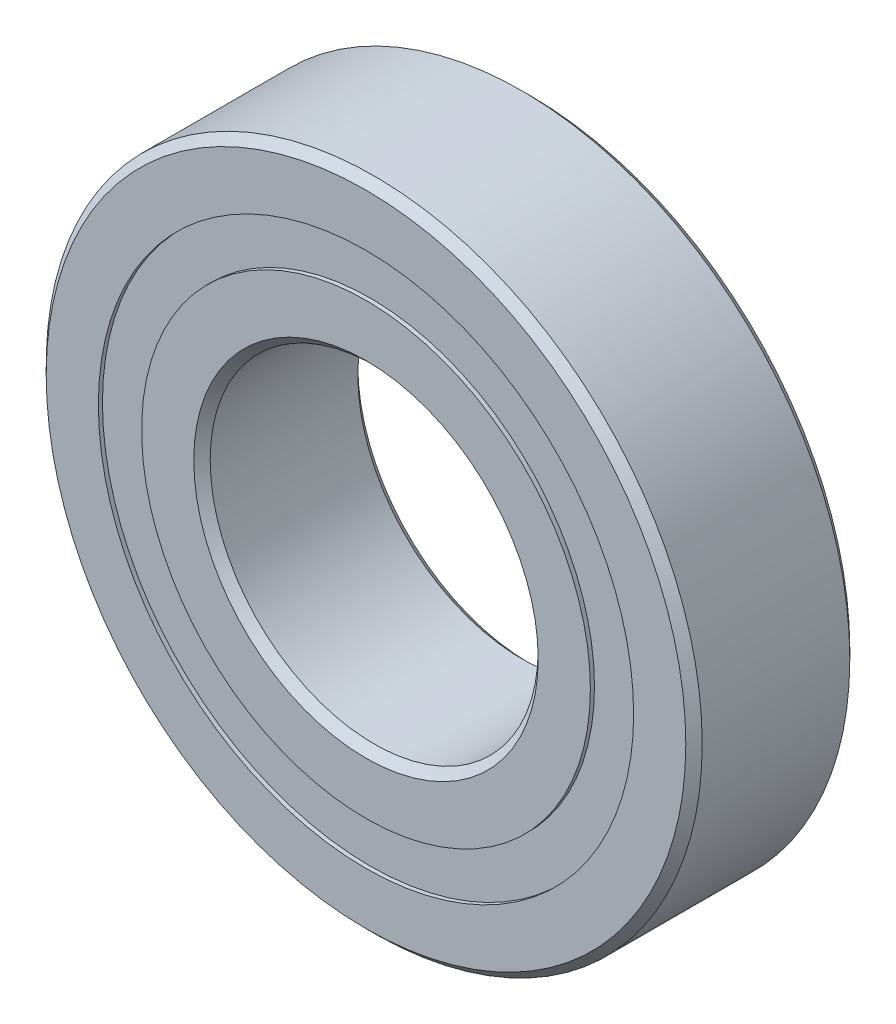
ISO-10303-21;
HEADER;
FILE_DESCRIPTION(('STEP AP214'),'2;1');
FILE_NAME('part.step','',(''),(''),'','','');
FILE_SCHEMA(('AUTOMOTIVE_DESIGN { 1 0 10303 214 1 1 1 1 }'));
ENDSEC;
DATA;
#1=APPLICATION_CONTEXT('core data for automotive mechanical design processes');
#2=APPLICATION_PROTOCOL_DEFINITION('international standard','automotive_design',2000,#1);
#3=PRODUCT_CONTEXT('',#1,'mechanical');
#4=PRODUCT('Part','Part','',(#3));
#5=PRODUCT_RELATED_PRODUCT_CATEGORY('part','',(#4));
#6=PRODUCT_DEFINITION_FORMATION('','',#4);
#7=PRODUCT_DEFINITION_CONTEXT('part definition',#1,'design');
#8=PRODUCT_DEFINITION('design','',#6,#7);
#9=PRODUCT_DEFINITION_SHAPE('','',#8);
#10=(LENGTH_UNIT() NAMED_UNIT(*) SI_UNIT(.MILLI.,.METRE.));
#11=(NAMED_UNIT(*) PLANE_ANGLE_UNIT() SI_UNIT($,.RADIAN.));
#12=(NAMED_UNIT(*) SI_UNIT($,.STERADIAN.) SOLID_ANGLE_UNIT());
#13=UNCERTAINTY_MEASURE_WITH_UNIT(LENGTH_MEASURE(1.E-05),#10,'distance_accuracy_value','');
#14=(GEOMETRIC_REPRESENTATION_CONTEXT(3) GLOBAL_UNCERTAINTY_ASSIGNED_CONTEXT((#13)) GLOBAL_UNIT_ASSIGNED_CONTEXT((#10,
#11,#12)) REPRESENTATION_CONTEXT('',''));
#15=CARTESIAN_POINT('',(0.,0.,0.));
#16=DIRECTION('',(0.,0.,1.));
#17=DIRECTION('',(1.,0.,0.));
#18=AXIS2_PLACEMENT_3D('',#15,#16,#17);
#19=CARTESIAN_POINT('',(0.,20.7247252747253,-6.0325));
#20=DIRECTION('',(0.,0.,1.));
#21=DIRECTION('',(1.,0.,0.));
#22=AXIS2_PLACEMENT_3D('',#19,#20,#21);
#23=PLANE('',#22);
#24=CARTESIAN_POINT('',(0.,0.,-6.0325));
#25=DIRECTION('',(0.,0.,1.));
#26=DIRECTION('',(1.,0.,0.));
#27=AXIS2_PLACEMENT_3D('',#24,#25,#26);
#28=CIRCLE('',#27,20.7247252747253);
#29=CARTESIAN_POINT('',(20.7247252747253,0.,-6.0325));
#30=VERTEX_POINT('',#29);
#31=EDGE_CURVE('E60',#30,#30,#28,.T.);
#32=ORIENTED_EDGE('',*,*,#31,.F.);
#33=EDGE_LOOP('',(#32));
#34=FACE_BOUND('',#33,.T.);
#35=CARTESIAN_POINT('',(0.,0.,-6.0325));
#36=DIRECTION('',(0.,0.,1.));
#37=DIRECTION('',(1.,0.,0.));
#38=AXIS2_PLACEMENT_3D('',#35,#36,#37);
#39=CIRCLE('',#38,17.3752747252747);
#40=CARTESIAN_POINT('',(17.3752747252747,0.,-6.0325));
#41=VERTEX_POINT('',#40);
#42=EDGE_CURVE('E11',#41,#41,#39,.T.);
#43=ORIENTED_EDGE('',*,*,#42,.T.);
#44=EDGE_LOOP('',(#43));
#45=FACE_BOUND('',#44,.T.);
#46=ADVANCED_FACE('F46',(#34,#45),#23,.F.);
#47=CARTESIAN_POINT('',(0.,0.,6.35));
#48=DIRECTION('',(0.,0.,1.));
#49=DIRECTION('',(1.,0.,0.));
#50=AXIS2_PLACEMENT_3D('',#47,#48,#49);
#51=CYLINDRICAL_SURFACE('',#50,17.3752747252747);
#52=ORIENTED_EDGE('',*,*,#42,.F.);
#53=EDGE_LOOP('',(#52));
#54=FACE_BOUND('',#53,.T.);
#55=CARTESIAN_POINT('',(0.,0.,-3.28171342706955));
#56=DIRECTION('',(0.,0.,1.));
#57=DIRECTION('',(1.,0.,0.));
#58=AXIS2_PLACEMENT_3D('',#55,#56,#57);
#59=CIRCLE('',#58,17.3752747252747);
#60=CARTESIAN_POINT('',(17.3752747252747,0.,-3.28171342706955));
#61=VERTEX_POINT('',#60);
#62=EDGE_CURVE('E52',#61,#61,#59,.T.);
#63=ORIENTED_EDGE('',*,*,#62,.T.);
#64=EDGE_LOOP('',(#63));
#65=FACE_BOUND('',#64,.T.);
#66=ADVANCED_FACE('F69',(#54,#65),#51,.F.);
#67=CARTESIAN_POINT('',(0.,20.7247252747253,-3.28171342706955));
#68=DIRECTION('',(0.,0.,-1.));
#69=DIRECTION('',(-1.,0.,0.));
#70=AXIS2_PLACEMENT_3D('',#67,#68,#69);
#71=PLANE('',#70);
#72=ORIENTED_EDGE('',*,*,#62,.F.);
#73=EDGE_LOOP('',(#72));
#74=FACE_BOUND('',#73,.T.);
#75=CARTESIAN_POINT('',(0.,0.,-3.28171342706955));
#76=DIRECTION('',(0.,0.,1.));
#77=DIRECTION('',(1.,0.,0.));
#78=AXIS2_PLACEMENT_3D('',#75,#76,#77);
#79=CIRCLE('',#78,20.7247252747253);
#80=CARTESIAN_POINT('',(20.7247252747253,0.,-3.28171342706955));
#81=VERTEX_POINT('',#80);
#82=EDGE_CURVE('E56',#81,#81,#79,.T.);
#83=ORIENTED_EDGE('',*,*,#82,.T.);
#84=EDGE_LOOP('',(#83));
#85=FACE_BOUND('',#84,.T.);
#86=ADVANCED_FACE('F73',(#74,#85),#71,.F.);
#87=CARTESIAN_POINT('',(0.,0.,6.35));
#88=DIRECTION('',(0.,0.,1.));
#89=DIRECTION('',(1.,0.,0.));
#90=AXIS2_PLACEMENT_3D('',#87,#88,#89);
#91=CYLINDRICAL_SURFACE('',#90,20.7247252747253);
#92=ORIENTED_EDGE('',*,*,#82,.F.);
#93=EDGE_LOOP('',(#92));
#94=FACE_BOUND('',#93,.T.);
#95=ORIENTED_EDGE('',*,*,#31,.T.);
#96=EDGE_LOOP('',(#95));
#97=FACE_BOUND('',#96,.T.);
#98=ADVANCED_FACE('F66',(#94,#97),#91,.T.);
#99=CLOSED_SHELL('',(#46,#66,#86,#98));
#100=MANIFOLD_SOLID_BREP('B2',#99);
#101=CARTESIAN_POINT('',(0.,20.7247252747253,6.0325));
#102=DIRECTION('',(0.,0.,-1.));
#103=DIRECTION('',(-1.,0.,0.));
#104=AXIS2_PLACEMENT_3D('',#101,#102,#103);
#105=PLANE('',#104);
#106=CARTESIAN_POINT('',(0.,0.,6.0325));
#107=DIRECTION('',(0.,0.,1.));
#108=DIRECTION('',(1.,0.,0.));
#109=AXIS2_PLACEMENT_3D('',#106,#107,#108);
#110=CIRCLE('',#109,17.3752747252747);
#111=CARTESIAN_POINT('',(17.3752747252747,0.,6.0325));
#112=VERTEX_POINT('',#111);
#113=EDGE_CURVE('E45',#112,#112,#110,.T.);
#114=ORIENTED_EDGE('',*,*,#113,.F.);
#115=EDGE_LOOP('',(#114));
#116=FACE_BOUND('',#115,.T.);
#117=CARTESIAN_POINT('',(0.,0.,6.0325));
#118=DIRECTION('',(0.,0.,1.));
#119=DIRECTION('',(1.,0.,0.));
#120=AXIS2_PLACEMENT_3D('',#117,#118,#119);
#121=CIRCLE('',#120,20.7247252747253);
#122=CARTESIAN_POINT('',(20.7247252747253,0.,6.0325));
#123=VERTEX_POINT('',#122);
#124=EDGE_CURVE('E128',#123,#123,#121,.T.);
#125=ORIENTED_EDGE('',*,*,#124,.T.);
#126=EDGE_LOOP('',(#125));
#127=FACE_BOUND('',#126,.T.);
#128=ADVANCED_FACE('F114',(#116,#127),#105,.F.);
#129=CARTESIAN_POINT('',(0.,0.,6.35));
#130=DIRECTION('',(0.,0.,1.));
#131=DIRECTION('',(1.,0.,0.));
#132=AXIS2_PLACEMENT_3D('',#129,#130,#131);
#133=CYLINDRICAL_SURFACE('',#132,17.3752747252747);
#134=CARTESIAN_POINT('',(0.,0.,3.28171342706955));
#135=DIRECTION('',(0.,0.,1.));
#136=DIRECTION('',(1.,0.,0.));
#137=AXIS2_PLACEMENT_3D('',#134,#135,#136);
#138=CIRCLE('',#137,17.3752747252747);
#139=CARTESIAN_POINT('',(17.3752747252747,0.,3.28171342706955));
#140=VERTEX_POINT('',#139);
#141=EDGE_CURVE('E120',#140,#140,#138,.T.);
#142=ORIENTED_EDGE('',*,*,#141,.F.);
#143=EDGE_LOOP('',(#142));
#144=FACE_BOUND('',#143,.T.);
#145=ORIENTED_EDGE('',*,*,#113,.T.);
#146=EDGE_LOOP('',(#145));
#147=FACE_BOUND('',#146,.T.);
#148=ADVANCED_FACE('F143',(#144,#147),#133,.F.);
#149=CARTESIAN_POINT('',(0.,20.7247252747253,3.28171342706955));
#150=DIRECTION('',(0.,0.,1.));
#151=DIRECTION('',(1.,0.,0.));
#152=AXIS2_PLACEMENT_3D('',#149,#150,#151);
#153=PLANE('',#152);
#154=CARTESIAN_POINT('',(0.,0.,3.28171342706955));
#155=DIRECTION('',(0.,0.,1.));
#156=DIRECTION('',(1.,0.,0.));
#157=AXIS2_PLACEMENT_3D('',#154,#155,#156);
#158=CIRCLE('',#157,20.7247252747253);
#159=CARTESIAN_POINT('',(20.7247252747253,0.,3.28171342706955));
#160=VERTEX_POINT('',#159);
#161=EDGE_CURVE('E124',#160,#160,#158,.T.);
#162=ORIENTED_EDGE('',*,*,#161,.F.);
#163=EDGE_LOOP('',(#162));
#164=FACE_BOUND('',#163,.T.);
#165=ORIENTED_EDGE('',*,*,#141,.T.);
#166=EDGE_LOOP('',(#165));
#167=FACE_BOUND('',#166,.T.);
#168=ADVANCED_FACE('F138',(#164,#167),#153,.F.);
#169=CARTESIAN_POINT('',(0.,0.,6.35));
#170=DIRECTION('',(0.,0.,1.));
#171=DIRECTION('',(1.,0.,0.));
#172=AXIS2_PLACEMENT_3D('',#169,#170,#171);
#173=CYLINDRICAL_SURFACE('',#172,20.7247252747253);
#174=ORIENTED_EDGE('',*,*,#124,.F.);
#175=EDGE_LOOP('',(#174));
#176=FACE_BOUND('',#175,.T.);
#177=ORIENTED_EDGE('',*,*,#161,.T.);
#178=EDGE_LOOP('',(#177));
#179=FACE_BOUND('',#178,.T.);
#180=ADVANCED_FACE('F135',(#176,#179),#173,.T.);
#181=CLOSED_SHELL('',(#128,#148,#168,#180));
#182=MANIFOLD_SOLID_BREP('B6',#181);
#183=CARTESIAN_POINT('',(-9.52499999999979,16.4977839420937,0.));
#184=DIRECTION('',(0.,0.,1.));
#185=DIRECTION('',(-0.499999999999989,0.866025403784445,0.));
#186=AXIS2_PLACEMENT_3D('',#183,#184,#185);
#187=SPHERICAL_SURFACE('',#186,3.28171342706955);
#188=CARTESIAN_POINT('',(-9.52499999999979,16.4977839420937,3.28171342706955));
#189=VERTEX_POINT('',#188);
#190=VERTEX_LOOP('',#189);
#191=FACE_BOUND('',#190,.T.);
#192=ADVANCED_FACE('F182',(#191),#187,.T.);
#193=CLOSED_SHELL('',(#192));
#194=MANIFOLD_SOLID_BREP('B40',#193);
#195=CARTESIAN_POINT('',(-16.4977839420934,9.52500000000019,0.));
#196=DIRECTION('',(0.,0.,1.));
#197=DIRECTION('',(-0.866025403784433,0.50000000000001,0.));
#198=AXIS2_PLACEMENT_3D('',#195,#196,#197);
#199=SPHERICAL_SURFACE('',#198,3.28171342706955);
#200=CARTESIAN_POINT('',(-16.4977839420934,9.52500000000019,3.28171342706955));
#201=VERTEX_POINT('',#200);
#202=VERTEX_LOOP('',#201);
#203=FACE_BOUND('',#202,.T.);
#204=ADVANCED_FACE('F203',(#203),#199,.T.);
#205=CLOSED_SHELL('',(#204));
#206=MANIFOLD_SOLID_BREP('B110',#205);
#207=CARTESIAN_POINT('',(-19.05,1.99538158514885E-13,0.));
#208=DIRECTION('',(0.,0.,1.));
#209=DIRECTION('',(-1.,0.,0.));
#210=AXIS2_PLACEMENT_3D('',#207,#208,#209);
#211=SPHERICAL_SURFACE('',#210,3.28171342706955);
#212=CARTESIAN_POINT('',(-19.05,1.99538158514885E-13,3.28171342706955));
#213=VERTEX_POINT('',#212);
#214=VERTEX_LOOP('',#213);
#215=FACE_BOUND('',#214,.T.);
#216=ADVANCED_FACE('F224',(#215),#211,.T.);
#217=CLOSED_SHELL('',(#216));
#218=MANIFOLD_SOLID_BREP('B178',#217);
#219=CARTESIAN_POINT('',(-16.4977839420936,-9.52499999999985,0.));
#220=DIRECTION('',(0.,0.,1.));
#221=DIRECTION('',(-0.866025403784443,-0.499999999999992,0.));
#222=AXIS2_PLACEMENT_3D('',#219,#220,#221);
#223=SPHERICAL_SURFACE('',#222,3.28171342706955);
#224=CARTESIAN_POINT('',(-16.4977839420936,-9.52499999999985,3.28171342706955));
#225=VERTEX_POINT('',#224);
#226=VERTEX_LOOP('',#225);
#227=FACE_BOUND('',#226,.T.);
#228=ADVANCED_FACE('F245',(#227),#223,.T.);
#229=CLOSED_SHELL('',(#228));
#230=MANIFOLD_SOLID_BREP('B199',#229);
#231=CARTESIAN_POINT('',(-9.52500000000013,-16.4977839420935,0.));
#232=DIRECTION('',(0.,0.,1.));
#233=DIRECTION('',(-0.500000000000007,-0.866025403784435,0.));
#234=AXIS2_PLACEMENT_3D('',#231,#232,#233);
#235=SPHERICAL_SURFACE('',#234,3.28171342706955);
#236=CARTESIAN_POINT('',(-9.52500000000013,-16.4977839420935,3.28171342706955));
#237=VERTEX_POINT('',#236);
#238=VERTEX_LOOP('',#237);
#239=FACE_BOUND('',#238,.T.);
#240=ADVANCED_FACE('F266',(#239),#235,.T.);
#241=CLOSED_SHELL('',(#240));
#242=MANIFOLD_SOLID_BREP('B220',#241);
#243=CARTESIAN_POINT('',(-1.33025439009923E-13,-19.05,0.));
#244=DIRECTION('',(0.,0.,1.));
#245=DIRECTION('',(0.,-1.,0.));
#246=AXIS2_PLACEMENT_3D('',#243,#244,#245);
#247=SPHERICAL_SURFACE('',#246,3.28171342706955);
#248=CARTESIAN_POINT('',(-1.33025439009923E-13,-19.05,3.28171342706955));
#249=VERTEX_POINT('',#248);
#250=VERTEX_LOOP('',#249);
#251=FACE_BOUND('',#250,.T.);
#252=ADVANCED_FACE('F287',(#251),#247,.T.);
#253=CLOSED_SHELL('',(#252));
#254=MANIFOLD_SOLID_BREP('B241',#253);
#255=CARTESIAN_POINT('',(9.5249999999999,-16.4977839420936,0.));
#256=DIRECTION('',(0.,0.,1.));
#257=DIRECTION('',(0.499999999999995,-0.866025403784442,0.));
#258=AXIS2_PLACEMENT_3D('',#255,#256,#257);
#259=SPHERICAL_SURFACE('',#258,3.28171342706955);
#260=CARTESIAN_POINT('',(9.5249999999999,-16.4977839420936,3.28171342706955));
#261=VERTEX_POINT('',#260);
#262=VERTEX_LOOP('',#261);
#263=FACE_BOUND('',#262,.T.);
#264=ADVANCED_FACE('F308',(#263),#259,.T.);
#265=CLOSED_SHELL('',(#264));
#266=MANIFOLD_SOLID_BREP('B262',#265);
#267=CARTESIAN_POINT('',(16.4977839420935,-9.52500000000008,0.));
#268=DIRECTION('',(0.,0.,1.));
#269=DIRECTION('',(0.866025403784436,-0.500000000000004,0.));
#270=AXIS2_PLACEMENT_3D('',#267,#268,#269);
#271=SPHERICAL_SURFACE('',#270,3.28171342706955);
#272=CARTESIAN_POINT('',(16.4977839420935,-9.52500000000008,3.28171342706955));
#273=VERTEX_POINT('',#272);
#274=VERTEX_LOOP('',#273);
#275=FACE_BOUND('',#274,.T.);
#276=ADVANCED_FACE('F329',(#275),#271,.T.);
#277=CLOSED_SHELL('',(#276));
#278=MANIFOLD_SOLID_BREP('B283',#277);
#279=CARTESIAN_POINT('',(19.05,0.,0.));
#280=DIRECTION('',(0.,0.,1.));
#281=DIRECTION('',(1.,0.,0.));
#282=AXIS2_PLACEMENT_3D('',#279,#280,#281);
#283=SPHERICAL_SURFACE('',#282,3.28171342706955);
#284=CARTESIAN_POINT('',(19.05,0.,3.28171342706955));
#285=VERTEX_POINT('',#284);
#286=VERTEX_LOOP('',#285);
#287=FACE_BOUND('',#286,.T.);
#288=ADVANCED_FACE('F350',(#287),#283,.T.);
#289=CLOSED_SHELL('',(#288));
#290=MANIFOLD_SOLID_BREP('B304',#289);
#291=CARTESIAN_POINT('',(16.4977839420936,9.52499999999996,0.));
#292=DIRECTION('',(0.,0.,1.));
#293=DIRECTION('',(0.86602540378444,0.499999999999998,0.));
#294=AXIS2_PLACEMENT_3D('',#291,#292,#293);
#295=SPHERICAL_SURFACE('',#294,3.28171342706955);
#296=CARTESIAN_POINT('',(16.4977839420936,9.52499999999996,3.28171342706955));
#297=VERTEX_POINT('',#296);
#298=VERTEX_LOOP('',#297);
#299=FACE_BOUND('',#298,.T.);
#300=ADVANCED_FACE('F371',(#299),#295,.T.);
#301=CLOSED_SHELL('',(#300));
#302=MANIFOLD_SOLID_BREP('B325',#301);
#303=CARTESIAN_POINT('',(9.52500000000002,16.4977839420935,0.));
#304=DIRECTION('',(0.,0.,1.));
#305=DIRECTION('',(0.500000000000001,0.866025403784438,0.));
#306=AXIS2_PLACEMENT_3D('',#303,#304,#305);
#307=SPHERICAL_SURFACE('',#306,3.28171342706955);
#308=CARTESIAN_POINT('',(9.52500000000002,16.4977839420935,3.28171342706955));
#309=VERTEX_POINT('',#308);
#310=VERTEX_LOOP('',#309);
#311=FACE_BOUND('',#310,.T.);
#312=ADVANCED_FACE('F392',(#311),#307,.T.);
#313=CLOSED_SHELL('',(#312));
#314=MANIFOLD_SOLID_BREP('B346',#313);
#315=CARTESIAN_POINT('',(0.,19.05,0.));
#316=DIRECTION('',(0.,0.,1.));
#317=DIRECTION('',(0.,1.,0.));
#318=AXIS2_PLACEMENT_3D('',#315,#316,#317);
#319=SPHERICAL_SURFACE('',#318,3.28171342706955);
#320=CARTESIAN_POINT('',(0.,19.05,3.28171342706955));
#321=VERTEX_POINT('',#320);
#322=VERTEX_LOOP('',#321);
#323=FACE_BOUND('',#322,.T.);
#324=ADVANCED_FACE('F415',(#323),#319,.T.);
#325=CLOSED_SHELL('',(#324));
#326=MANIFOLD_SOLID_BREP('B367',#325);
#327=CARTESIAN_POINT('',(0.,17.3752747252747,6.35));
#328=DIRECTION('',(0.,0.,-1.));
#329=DIRECTION('',(-1.,0.,0.));
#330=AXIS2_PLACEMENT_3D('',#327,#328,#329);
#331=PLANE('',#330);
#332=CARTESIAN_POINT('',(0.,0.,6.35));
#333=DIRECTION('',(0.,0.,1.));
#334=DIRECTION('',(1.,0.,0.));
#335=AXIS2_PLACEMENT_3D('',#332,#333,#334);
#336=CIRCLE('',#335,13.335);
#337=CARTESIAN_POINT('',(13.335,0.,6.35));
#338=VERTEX_POINT('',#337);
#339=EDGE_CURVE('E463',#338,#338,#336,.T.);
#340=ORIENTED_EDGE('',*,*,#339,.F.);
#341=EDGE_LOOP('',(#340));
#342=FACE_BOUND('',#341,.T.);
#343=CARTESIAN_POINT('',(0.,0.,6.35));
#344=DIRECTION('',(0.,0.,1.));
#345=DIRECTION('',(1.,0.,0.));
#346=AXIS2_PLACEMENT_3D('',#343,#344,#345);
#347=CIRCLE('',#346,17.3752747252747);
#348=CARTESIAN_POINT('',(17.3752747252747,0.,6.35));
#349=VERTEX_POINT('',#348);
#350=EDGE_CURVE('E414',#349,#349,#347,.T.);
#351=ORIENTED_EDGE('',*,*,#350,.T.);
#352=EDGE_LOOP('',(#351));
#353=FACE_BOUND('',#352,.T.);
#354=ADVANCED_FACE('F435',(#342,#353),#331,.F.);
#355=CARTESIAN_POINT('',(0.,0.,6.35));
#356=DIRECTION('',(0.,0.,1.));
#357=DIRECTION('',(1.,0.,0.));
#358=AXIS2_PLACEMENT_3D('',#355,#356,#357);
#359=CYLINDRICAL_SURFACE('',#358,17.3752747252747);
#360=ORIENTED_EDGE('',*,*,#350,.F.);
#361=EDGE_LOOP('',(#360));
#362=FACE_BOUND('',#361,.T.);
#363=CARTESIAN_POINT('',(0.,0.,2.82222222222222));
#364=DIRECTION('',(0.,0.,1.));
#365=DIRECTION('',(1.,0.,0.));
#366=AXIS2_PLACEMENT_3D('',#363,#364,#365);
#367=CIRCLE('',#366,17.3752747252747);
#368=CARTESIAN_POINT('',(17.3752747252747,0.,2.82222222222222));
#369=VERTEX_POINT('',#368);
#370=EDGE_CURVE('E441',#369,#369,#367,.T.);
#371=ORIENTED_EDGE('',*,*,#370,.T.);
#372=EDGE_LOOP('',(#371));
#373=FACE_BOUND('',#372,.T.);
#374=ADVANCED_FACE('F470',(#362,#373),#359,.T.);
#375=CARTESIAN_POINT('',(0.,0.,0.));
#376=DIRECTION('',(0.,0.,1.));
#377=DIRECTION('',(1.,0.,0.));
#378=AXIS2_PLACEMENT_3D('',#375,#376,#377);
#379=TOROIDAL_SURFACE('',#378,19.05,3.28171342706954);
#380=ORIENTED_EDGE('',*,*,#370,.F.);
#381=EDGE_LOOP('',(#380));
#382=FACE_BOUND('',#381,.T.);
#383=CARTESIAN_POINT('',(0.,0.,-2.82222222222223));
#384=DIRECTION('',(0.,0.,1.));
#385=DIRECTION('',(1.,0.,0.));
#386=AXIS2_PLACEMENT_3D('',#383,#384,#385);
#387=CIRCLE('',#386,17.3752747252747);
#388=CARTESIAN_POINT('',(17.3752747252747,0.,-2.82222222222223));
#389=VERTEX_POINT('',#388);
#390=EDGE_CURVE('E445',#389,#389,#387,.T.);
#391=ORIENTED_EDGE('',*,*,#390,.T.);
#392=EDGE_LOOP('',(#391));
#393=FACE_BOUND('',#392,.T.);
#394=ADVANCED_FACE('F474',(#382,#393),#379,.F.);
#395=CARTESIAN_POINT('',(0.,0.,6.35));
#396=DIRECTION('',(0.,0.,1.));
#397=DIRECTION('',(1.,0.,0.));
#398=AXIS2_PLACEMENT_3D('',#395,#396,#397);
#399=CYLINDRICAL_SURFACE('',#398,17.3752747252747);
#400=ORIENTED_EDGE('',*,*,#390,.F.);
#401=EDGE_LOOP('',(#400));
#402=FACE_BOUND('',#401,.T.);
#403=CARTESIAN_POINT('',(0.,0.,-6.35));
#404=DIRECTION('',(0.,0.,1.));
#405=DIRECTION('',(1.,0.,0.));
#406=AXIS2_PLACEMENT_3D('',#403,#404,#405);
#407=CIRCLE('',#406,17.3752747252747);
#408=CARTESIAN_POINT('',(17.3752747252747,0.,-6.35));
#409=VERTEX_POINT('',#408);
#410=EDGE_CURVE('E449',#409,#409,#407,.T.);
#411=ORIENTED_EDGE('',*,*,#410,.T.);
#412=EDGE_LOOP('',(#411));
#413=FACE_BOUND('',#412,.T.);
#414=ADVANCED_FACE('F479',(#402,#413),#399,.T.);
#415=CARTESIAN_POINT('',(0.,13.335,-6.35));
#416=DIRECTION('',(0.,0.,1.));
#417=DIRECTION('',(1.,0.,0.));
#418=AXIS2_PLACEMENT_3D('',#415,#416,#417);
#419=PLANE('',#418);
#420=ORIENTED_EDGE('',*,*,#410,.F.);
#421=EDGE_LOOP('',(#420));
#422=FACE_BOUND('',#421,.T.);
#423=CARTESIAN_POINT('',(0.,0.,-6.35));
#424=DIRECTION('',(0.,0.,1.));
#425=DIRECTION('',(1.,0.,0.));
#426=AXIS2_PLACEMENT_3D('',#423,#424,#425);
#427=CIRCLE('',#426,13.335);
#428=CARTESIAN_POINT('',(13.335,0.,-6.35));
#429=VERTEX_POINT('',#428);
#430=EDGE_CURVE('E454',#429,#429,#427,.T.);
#431=ORIENTED_EDGE('',*,*,#430,.T.);
#432=EDGE_LOOP('',(#431));
#433=FACE_BOUND('',#432,.T.);
#434=ADVANCED_FACE('F485',(#422,#433),#419,.F.);
#435=CARTESIAN_POINT('',(0.,0.,-5.715));
#436=DIRECTION('',(0.,0.,-1.));
#437=DIRECTION('',(-1.,0.,0.));
#438=AXIS2_PLACEMENT_3D('',#435,#436,#437);
#439=CONICAL_SURFACE('',#438,12.7,0.785398163397444);
#440=ORIENTED_EDGE('',*,*,#430,.F.);
#441=EDGE_LOOP('',(#440));
#442=FACE_BOUND('',#441,.T.);
#443=CARTESIAN_POINT('',(0.,0.,-5.715));
#444=DIRECTION('',(0.,0.,1.));
#445=DIRECTION('',(1.,0.,0.));
#446=AXIS2_PLACEMENT_3D('',#443,#444,#445);
#447=CIRCLE('',#446,12.7);
#448=CARTESIAN_POINT('',(12.7,0.,-5.715));
#449=VERTEX_POINT('',#448);
#450=EDGE_CURVE('E457',#449,#449,#447,.T.);
#451=ORIENTED_EDGE('',*,*,#450,.T.);
#452=EDGE_LOOP('',(#451));
#453=FACE_BOUND('',#452,.T.);
#454=ADVANCED_FACE('F489',(#442,#453),#439,.F.);
#455=CARTESIAN_POINT('',(0.,0.,6.35));
#456=DIRECTION('',(0.,0.,1.));
#457=DIRECTION('',(1.,0.,0.));
#458=AXIS2_PLACEMENT_3D('',#455,#456,#457);
#459=CYLINDRICAL_SURFACE('',#458,12.7);
#460=ORIENTED_EDGE('',*,*,#450,.F.);
#461=EDGE_LOOP('',(#460));
#462=FACE_BOUND('',#461,.T.);
#463=CARTESIAN_POINT('',(0.,0.,5.71500000000001));
#464=DIRECTION('',(0.,0.,1.));
#465=DIRECTION('',(1.,0.,0.));
#466=AXIS2_PLACEMENT_3D('',#463,#464,#465);
#467=CIRCLE('',#466,12.7);
#468=CARTESIAN_POINT('',(12.7,0.,5.71500000000001));
#469=VERTEX_POINT('',#468);
#470=EDGE_CURVE('E460',#469,#469,#467,.T.);
#471=ORIENTED_EDGE('',*,*,#470,.T.);
#472=EDGE_LOOP('',(#471));
#473=FACE_BOUND('',#472,.T.);
#474=ADVANCED_FACE('F493',(#462,#473),#459,.F.);
#475=CARTESIAN_POINT('',(0.,0.,6.35));
#476=DIRECTION('',(0.,0.,1.));
#477=DIRECTION('',(1.,0.,0.));
#478=AXIS2_PLACEMENT_3D('',#475,#476,#477);
#479=CONICAL_SURFACE('',#478,13.335,0.785398163397454);
#480=ORIENTED_EDGE('',*,*,#470,.F.);
#481=EDGE_LOOP('',(#480));
#482=FACE_BOUND('',#481,.T.);
#483=ORIENTED_EDGE('',*,*,#339,.T.);
#484=EDGE_LOOP('',(#483));
#485=FACE_BOUND('',#484,.T.);
#486=ADVANCED_FACE('F467',(#482,#485),#479,.F.);
#487=CLOSED_SHELL('',(#354,#374,#394,#414,#434,#454,#474,#486));
#488=MANIFOLD_SOLID_BREP('B388',#487);
#489=CARTESIAN_POINT('',(0.,0.,5.715));
#490=DIRECTION('',(0.,0.,-1.));
#491=DIRECTION('',(-1.,0.,0.));
#492=AXIS2_PLACEMENT_3D('',#489,#490,#491);
#493=CONICAL_SURFACE('',#492,25.4,0.785398163397444);
#494=CARTESIAN_POINT('',(0.,0.,6.35));
#495=DIRECTION('',(0.,0.,1.));
#496=DIRECTION('',(1.,0.,0.));
#497=AXIS2_PLACEMENT_3D('',#494,#495,#496);
#498=CIRCLE('',#497,24.765);
#499=CARTESIAN_POINT('',(24.765,0.,6.35));
#500=VERTEX_POINT('',#499);
#501=EDGE_CURVE('E585',#500,#500,#498,.T.);
#502=ORIENTED_EDGE('',*,*,#501,.F.);
#503=EDGE_LOOP('',(#502));
#504=FACE_BOUND('',#503,.T.);
#505=CARTESIAN_POINT('',(0.,0.,5.715));
#506=DIRECTION('',(0.,0.,1.));
#507=DIRECTION('',(1.,0.,0.));
#508=AXIS2_PLACEMENT_3D('',#505,#506,#507);
#509=CIRCLE('',#508,25.4);
#510=CARTESIAN_POINT('',(25.4,0.,5.715));
#511=VERTEX_POINT('',#510);
#512=EDGE_CURVE('E434',#511,#511,#509,.T.);
#513=ORIENTED_EDGE('',*,*,#512,.T.);
#514=EDGE_LOOP('',(#513));
#515=FACE_BOUND('',#514,.T.);
#516=ADVANCED_FACE('F557',(#504,#515),#493,.T.);
#517=CARTESIAN_POINT('',(0.,0.,6.35));
#518=DIRECTION('',(0.,0.,1.));
#519=DIRECTION('',(1.,0.,0.));
#520=AXIS2_PLACEMENT_3D('',#517,#518,#519);
#521=CYLINDRICAL_SURFACE('',#520,25.4);
#522=ORIENTED_EDGE('',*,*,#512,.F.);
#523=EDGE_LOOP('',(#522));
#524=FACE_BOUND('',#523,.T.);
#525=CARTESIAN_POINT('',(0.,0.,-5.715));
#526=DIRECTION('',(0.,0.,1.));
#527=DIRECTION('',(1.,0.,0.));
#528=AXIS2_PLACEMENT_3D('',#525,#526,#527);
#529=CIRCLE('',#528,25.4);
#530=CARTESIAN_POINT('',(25.4,0.,-5.715));
#531=VERTEX_POINT('',#530);
#532=EDGE_CURVE('E563',#531,#531,#529,.T.);
#533=ORIENTED_EDGE('',*,*,#532,.T.);
#534=EDGE_LOOP('',(#533));
#535=FACE_BOUND('',#534,.T.);
#536=ADVANCED_FACE('F592',(#524,#535),#521,.T.);
#537=CARTESIAN_POINT('',(0.,0.,-6.35));
#538=DIRECTION('',(0.,0.,1.));
#539=DIRECTION('',(1.,0.,0.));
#540=AXIS2_PLACEMENT_3D('',#537,#538,#539);
#541=CONICAL_SURFACE('',#540,24.765,0.785398163397444);
#542=ORIENTED_EDGE('',*,*,#532,.F.);
#543=EDGE_LOOP('',(#542));
#544=FACE_BOUND('',#543,.T.);
#545=CARTESIAN_POINT('',(0.,0.,-6.35));
#546=DIRECTION('',(0.,0.,1.));
#547=DIRECTION('',(1.,0.,0.));
#548=AXIS2_PLACEMENT_3D('',#545,#546,#547);
#549=CIRCLE('',#548,24.765);
#550=CARTESIAN_POINT('',(24.765,0.,-6.35));
#551=VERTEX_POINT('',#550);
#552=EDGE_CURVE('E567',#551,#551,#549,.T.);
#553=ORIENTED_EDGE('',*,*,#552,.T.);
#554=EDGE_LOOP('',(#553));
#555=FACE_BOUND('',#554,.T.);
#556=ADVANCED_FACE('F596',(#544,#555),#541,.T.);
#557=CARTESIAN_POINT('',(0.,24.765,-6.35));
#558=DIRECTION('',(0.,0.,1.));
#559=DIRECTION('',(1.,0.,0.));
#560=AXIS2_PLACEMENT_3D('',#557,#558,#559);
#561=PLANE('',#560);
#562=ORIENTED_EDGE('',*,*,#552,.F.);
#563=EDGE_LOOP('',(#562));
#564=FACE_BOUND('',#563,.T.);
#565=CARTESIAN_POINT('',(0.,0.,-6.35));
#566=DIRECTION('',(0.,0.,1.));
#567=DIRECTION('',(1.,0.,0.));
#568=AXIS2_PLACEMENT_3D('',#565,#566,#567);
#569=CIRCLE('',#568,20.7247252747253);
#570=CARTESIAN_POINT('',(20.7247252747253,0.,-6.35));
#571=VERTEX_POINT('',#570);
#572=EDGE_CURVE('E571',#571,#571,#569,.T.);
#573=ORIENTED_EDGE('',*,*,#572,.T.);
#574=EDGE_LOOP('',(#573));
#575=FACE_BOUND('',#574,.T.);
#576=ADVANCED_FACE('F601',(#564,#575),#561,.F.);
#577=CARTESIAN_POINT('',(0.,0.,6.35));
#578=DIRECTION('',(0.,0.,1.));
#579=DIRECTION('',(1.,0.,0.));
#580=AXIS2_PLACEMENT_3D('',#577,#578,#579);
#581=CYLINDRICAL_SURFACE('',#580,20.7247252747253);
#582=ORIENTED_EDGE('',*,*,#572,.F.);
#583=EDGE_LOOP('',(#582));
#584=FACE_BOUND('',#583,.T.);
#585=CARTESIAN_POINT('',(0.,0.,-2.82222222222222));
#586=DIRECTION('',(0.,0.,1.));
#587=DIRECTION('',(1.,0.,0.));
#588=AXIS2_PLACEMENT_3D('',#585,#586,#587);
#589=CIRCLE('',#588,20.7247252747253);
#590=CARTESIAN_POINT('',(20.7247252747253,0.,-2.82222222222222));
#591=VERTEX_POINT('',#590);
#592=EDGE_CURVE('E576',#591,#591,#589,.T.);
#593=ORIENTED_EDGE('',*,*,#592,.T.);
#594=EDGE_LOOP('',(#593));
#595=FACE_BOUND('',#594,.T.);
#596=ADVANCED_FACE('F607',(#584,#595),#581,.F.);
#597=CARTESIAN_POINT('',(0.,0.,0.));
#598=DIRECTION('',(0.,0.,1.));
#599=DIRECTION('',(1.,0.,0.));
#600=AXIS2_PLACEMENT_3D('',#597,#598,#599);
#601=TOROIDAL_SURFACE('',#600,19.05,3.28171342706955);
#602=ORIENTED_EDGE('',*,*,#592,.F.);
#603=EDGE_LOOP('',(#602));
#604=FACE_BOUND('',#603,.T.);
#605=CARTESIAN_POINT('',(0.,0.,2.82222222222222));
#606=DIRECTION('',(0.,0.,1.));
#607=DIRECTION('',(1.,0.,0.));
#608=AXIS2_PLACEMENT_3D('',#605,#606,#607);
#609=CIRCLE('',#608,20.7247252747253);
#610=CARTESIAN_POINT('',(20.7247252747253,0.,2.82222222222222));
#611=VERTEX_POINT('',#610);
#612=EDGE_CURVE('E579',#611,#611,#609,.T.);
#613=ORIENTED_EDGE('',*,*,#612,.T.);
#614=EDGE_LOOP('',(#613));
#615=FACE_BOUND('',#614,.T.);
#616=ADVANCED_FACE('F611',(#604,#615),#601,.F.);
#617=CARTESIAN_POINT('',(0.,0.,6.35));
#618=DIRECTION('',(0.,0.,1.));
#619=DIRECTION('',(1.,0.,0.));
#620=AXIS2_PLACEMENT_3D('',#617,#618,#619);
#621=CYLINDRICAL_SURFACE('',#620,20.7247252747253);
#622=ORIENTED_EDGE('',*,*,#612,.F.);
#623=EDGE_LOOP('',(#622));
#624=FACE_BOUND('',#623,.T.);
#625=CARTESIAN_POINT('',(0.,0.,6.35));
#626=DIRECTION('',(0.,0.,1.));
#627=DIRECTION('',(1.,0.,0.));
#628=AXIS2_PLACEMENT_3D('',#625,#626,#627);
#629=CIRCLE('',#628,20.7247252747253);
#630=CARTESIAN_POINT('',(20.7247252747253,0.,6.35));
#631=VERTEX_POINT('',#630);
#632=EDGE_CURVE('E582',#631,#631,#629,.T.);
#633=ORIENTED_EDGE('',*,*,#632,.T.);
#634=EDGE_LOOP('',(#633));
#635=FACE_BOUND('',#634,.T.);
#636=ADVANCED_FACE('F615',(#624,#635),#621,.F.);
#637=CARTESIAN_POINT('',(0.,24.765,6.35));
#638=DIRECTION('',(0.,0.,-1.));
#639=DIRECTION('',(-1.,0.,0.));
#640=AXIS2_PLACEMENT_3D('',#637,#638,#639);
#641=PLANE('',#640);
#642=ORIENTED_EDGE('',*,*,#632,.F.);
#643=EDGE_LOOP('',(#642));
#644=FACE_BOUND('',#643,.T.);
#645=ORIENTED_EDGE('',*,*,#501,.T.);
#646=EDGE_LOOP('',(#645));
#647=FACE_BOUND('',#646,.T.);
#648=ADVANCED_FACE('F589',(#644,#647),#641,.F.);
#649=CLOSED_SHELL('',(#516,#536,#556,#576,#596,#616,#636,#648));
#650=MANIFOLD_SOLID_BREP('B409',#649);
#651=ADVANCED_BREP_SHAPE_REPRESENTATION('',(#18,#100,#182,#194,#206,#218,#230,#242,#254,#266,
#278,#290,#302,#314,#326,#488,#650),#14);
#652=SHAPE_DEFINITION_REPRESENTATION(#9,#651);
ENDSEC;
END-ISO-10303-21;
